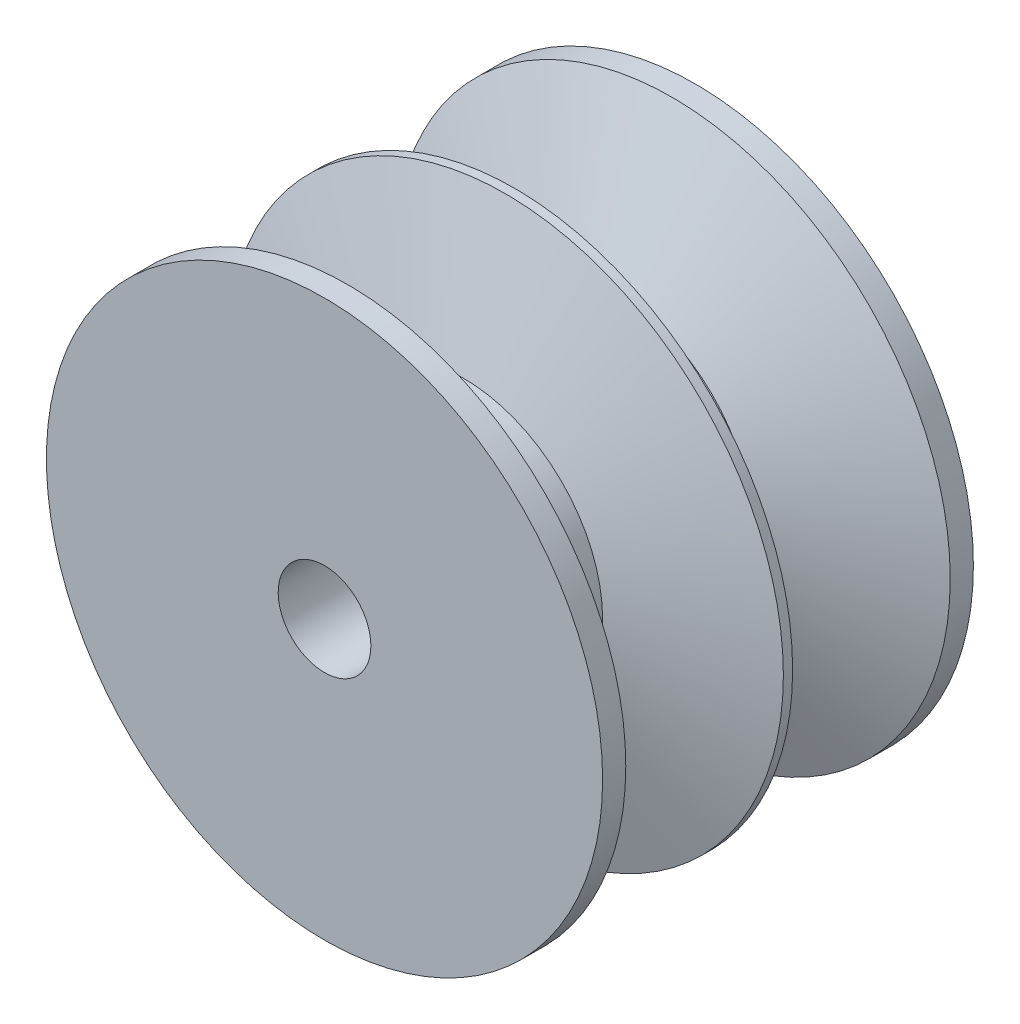
ISO-10303-21;
HEADER;
FILE_DESCRIPTION(('STEP AP214'),'2;1');
FILE_NAME('part.step','',(''),(''),'','','');
FILE_SCHEMA(('AUTOMOTIVE_DESIGN { 1 0 10303 214 1 1 1 1 }'));
ENDSEC;
DATA;
#1=APPLICATION_CONTEXT('core data for automotive mechanical design processes');
#2=APPLICATION_PROTOCOL_DEFINITION('international standard','automotive_design',2000,#1);
#3=PRODUCT_CONTEXT('',#1,'mechanical');
#4=PRODUCT('Part','Part','',(#3));
#5=PRODUCT_RELATED_PRODUCT_CATEGORY('part','',(#4));
#6=PRODUCT_DEFINITION_FORMATION('','',#4);
#7=PRODUCT_DEFINITION_CONTEXT('part definition',#1,'design');
#8=PRODUCT_DEFINITION('design','',#6,#7);
#9=PRODUCT_DEFINITION_SHAPE('','',#8);
#10=(LENGTH_UNIT() NAMED_UNIT(*) SI_UNIT(.MILLI.,.METRE.));
#11=(NAMED_UNIT(*) PLANE_ANGLE_UNIT() SI_UNIT($,.RADIAN.));
#12=(NAMED_UNIT(*) SI_UNIT($,.STERADIAN.) SOLID_ANGLE_UNIT());
#13=UNCERTAINTY_MEASURE_WITH_UNIT(LENGTH_MEASURE(1.E-05),#10,'distance_accuracy_value','');
#14=(GEOMETRIC_REPRESENTATION_CONTEXT(3) GLOBAL_UNCERTAINTY_ASSIGNED_CONTEXT((#13)) GLOBAL_UNIT_ASSIGNED_CONTEXT((#10,
#11,#12)) REPRESENTATION_CONTEXT('',''));
#15=CARTESIAN_POINT('',(0.,0.,0.));
#16=DIRECTION('',(0.,0.,1.));
#17=DIRECTION('',(1.,0.,0.));
#18=AXIS2_PLACEMENT_3D('',#15,#16,#17);
#19=CARTESIAN_POINT('',(0.,0.,8.));
#20=DIRECTION('',(0.,0.,-1.));
#21=DIRECTION('',(-1.,0.,0.));
#22=AXIS2_PLACEMENT_3D('',#19,#20,#21);
#23=PLANE('',#22);
#24=CARTESIAN_POINT('',(0.,0.,8.));
#25=DIRECTION('',(0.,0.,1.));
#26=DIRECTION('',(1.,0.,0.));
#27=AXIS2_PLACEMENT_3D('',#24,#25,#26);
#28=CIRCLE('',#27,2.);
#29=CARTESIAN_POINT('',(2.,0.,8.));
#30=VERTEX_POINT('',#29);
#31=EDGE_CURVE('E72',#30,#30,#28,.T.);
#32=ORIENTED_EDGE('',*,*,#31,.F.);
#33=EDGE_LOOP('',(#32));
#34=FACE_BOUND('',#33,.T.);
#35=CARTESIAN_POINT('',(0.,0.,8.));
#36=DIRECTION('',(0.,0.,1.));
#37=DIRECTION('',(1.,0.,0.));
#38=AXIS2_PLACEMENT_3D('',#35,#36,#37);
#39=CIRCLE('',#38,12.);
#40=CARTESIAN_POINT('',(12.,0.,8.));
#41=VERTEX_POINT('',#40);
#42=EDGE_CURVE('E11',#41,#41,#39,.T.);
#43=ORIENTED_EDGE('',*,*,#42,.T.);
#44=EDGE_LOOP('',(#43));
#45=FACE_BOUND('',#44,.T.);
#46=ADVANCED_FACE('F33',(#34,#45),#23,.F.);
#47=CARTESIAN_POINT('',(0.,0.,8.));
#48=DIRECTION('',(0.,0.,1.));
#49=DIRECTION('',(1.,0.,0.));
#50=AXIS2_PLACEMENT_3D('',#47,#48,#49);
#51=CYLINDRICAL_SURFACE('',#50,12.);
#52=ORIENTED_EDGE('',*,*,#42,.F.);
#53=EDGE_LOOP('',(#52));
#54=FACE_BOUND('',#53,.T.);
#55=CARTESIAN_POINT('',(0.,0.,7.));
#56=DIRECTION('',(0.,0.,1.));
#57=DIRECTION('',(1.,0.,0.));
#58=AXIS2_PLACEMENT_3D('',#55,#56,#57);
#59=CIRCLE('',#58,12.);
#60=CARTESIAN_POINT('',(12.,0.,7.));
#61=VERTEX_POINT('',#60);
#62=EDGE_CURVE('E41',#61,#61,#59,.T.);
#63=ORIENTED_EDGE('',*,*,#62,.T.);
#64=EDGE_LOOP('',(#63));
#65=FACE_BOUND('',#64,.T.);
#66=ADVANCED_FACE('F113',(#54,#65),#51,.T.);
#67=CARTESIAN_POINT('',(0.,0.,4.5));
#68=DIRECTION('',(0.,0.,1.));
#69=DIRECTION('',(1.,0.,0.));
#70=AXIS2_PLACEMENT_3D('',#67,#68,#69);
#71=CONICAL_SURFACE('',#70,6.,1.17600520709514);
#72=ORIENTED_EDGE('',*,*,#62,.F.);
#73=EDGE_LOOP('',(#72));
#74=FACE_BOUND('',#73,.T.);
#75=CARTESIAN_POINT('',(0.,0.,4.5));
#76=DIRECTION('',(0.,0.,1.));
#77=DIRECTION('',(1.,0.,0.));
#78=AXIS2_PLACEMENT_3D('',#75,#76,#77);
#79=CIRCLE('',#78,6.);
#80=CARTESIAN_POINT('',(6.,0.,4.5));
#81=VERTEX_POINT('',#80);
#82=EDGE_CURVE('E107',#81,#81,#79,.T.);
#83=ORIENTED_EDGE('',*,*,#82,.T.);
#84=EDGE_LOOP('',(#83));
#85=FACE_BOUND('',#84,.T.);
#86=ADVANCED_FACE('F115',(#74,#85),#71,.T.);
#87=CARTESIAN_POINT('',(0.,0.,8.));
#88=DIRECTION('',(0.,0.,1.));
#89=DIRECTION('',(1.,0.,0.));
#90=AXIS2_PLACEMENT_3D('',#87,#88,#89);
#91=CYLINDRICAL_SURFACE('',#90,6.);
#92=ORIENTED_EDGE('',*,*,#82,.F.);
#93=EDGE_LOOP('',(#92));
#94=FACE_BOUND('',#93,.T.);
#95=CARTESIAN_POINT('',(0.,0.,2.));
#96=DIRECTION('',(0.,0.,1.));
#97=DIRECTION('',(1.,0.,0.));
#98=AXIS2_PLACEMENT_3D('',#95,#96,#97);
#99=CIRCLE('',#98,6.);
#100=CARTESIAN_POINT('',(6.,0.,2.));
#101=VERTEX_POINT('',#100);
#102=EDGE_CURVE('E104',#101,#101,#99,.T.);
#103=ORIENTED_EDGE('',*,*,#102,.T.);
#104=EDGE_LOOP('',(#103));
#105=FACE_BOUND('',#104,.T.);
#106=ADVANCED_FACE('F118',(#94,#105),#91,.T.);
#107=CARTESIAN_POINT('',(0.,0.,0.200000000000001));
#108=DIRECTION('',(0.,0.,-1.));
#109=DIRECTION('',(-1.,0.,0.));
#110=AXIS2_PLACEMENT_3D('',#107,#108,#109);
#111=CONICAL_SURFACE('',#110,12.,1.27933953231703);
#112=ORIENTED_EDGE('',*,*,#102,.F.);
#113=EDGE_LOOP('',(#112));
#114=FACE_BOUND('',#113,.T.);
#115=CARTESIAN_POINT('',(0.,0.,0.200000000000001));
#116=DIRECTION('',(0.,0.,1.));
#117=DIRECTION('',(1.,0.,0.));
#118=AXIS2_PLACEMENT_3D('',#115,#116,#117);
#119=CIRCLE('',#118,12.);
#120=CARTESIAN_POINT('',(12.,0.,0.200000000000001));
#121=VERTEX_POINT('',#120);
#122=EDGE_CURVE('E101',#121,#121,#119,.T.);
#123=ORIENTED_EDGE('',*,*,#122,.T.);
#124=EDGE_LOOP('',(#123));
#125=FACE_BOUND('',#124,.T.);
#126=ADVANCED_FACE('F124',(#114,#125),#111,.T.);
#127=CARTESIAN_POINT('',(0.,0.,8.));
#128=DIRECTION('',(0.,0.,1.));
#129=DIRECTION('',(1.,0.,0.));
#130=AXIS2_PLACEMENT_3D('',#127,#128,#129);
#131=CYLINDRICAL_SURFACE('',#130,12.);
#132=ORIENTED_EDGE('',*,*,#122,.F.);
#133=EDGE_LOOP('',(#132));
#134=FACE_BOUND('',#133,.T.);
#135=CARTESIAN_POINT('',(0.,0.,-0.199999999999999));
#136=DIRECTION('',(0.,0.,1.));
#137=DIRECTION('',(1.,0.,0.));
#138=AXIS2_PLACEMENT_3D('',#135,#136,#137);
#139=CIRCLE('',#138,12.);
#140=CARTESIAN_POINT('',(12.,0.,-0.199999999999999));
#141=VERTEX_POINT('',#140);
#142=EDGE_CURVE('E98',#141,#141,#139,.T.);
#143=ORIENTED_EDGE('',*,*,#142,.T.);
#144=EDGE_LOOP('',(#143));
#145=FACE_BOUND('',#144,.T.);
#146=ADVANCED_FACE('F130',(#134,#145),#131,.T.);
#147=CARTESIAN_POINT('',(0.,0.,-2.));
#148=DIRECTION('',(0.,0.,1.));
#149=DIRECTION('',(1.,0.,0.));
#150=AXIS2_PLACEMENT_3D('',#147,#148,#149);
#151=CONICAL_SURFACE('',#150,6.,1.27933953231703);
#152=ORIENTED_EDGE('',*,*,#142,.F.);
#153=EDGE_LOOP('',(#152));
#154=FACE_BOUND('',#153,.T.);
#155=CARTESIAN_POINT('',(0.,0.,-2.));
#156=DIRECTION('',(0.,0.,1.));
#157=DIRECTION('',(1.,0.,0.));
#158=AXIS2_PLACEMENT_3D('',#155,#156,#157);
#159=CIRCLE('',#158,6.);
#160=CARTESIAN_POINT('',(6.,0.,-2.));
#161=VERTEX_POINT('',#160);
#162=EDGE_CURVE('E95',#161,#161,#159,.T.);
#163=ORIENTED_EDGE('',*,*,#162,.T.);
#164=EDGE_LOOP('',(#163));
#165=FACE_BOUND('',#164,.T.);
#166=ADVANCED_FACE('F136',(#154,#165),#151,.T.);
#167=CARTESIAN_POINT('',(0.,0.,8.));
#168=DIRECTION('',(0.,0.,1.));
#169=DIRECTION('',(1.,0.,0.));
#170=AXIS2_PLACEMENT_3D('',#167,#168,#169);
#171=CYLINDRICAL_SURFACE('',#170,6.);
#172=ORIENTED_EDGE('',*,*,#162,.F.);
#173=EDGE_LOOP('',(#172));
#174=FACE_BOUND('',#173,.T.);
#175=CARTESIAN_POINT('',(0.,0.,-4.5));
#176=DIRECTION('',(0.,0.,1.));
#177=DIRECTION('',(1.,0.,0.));
#178=AXIS2_PLACEMENT_3D('',#175,#176,#177);
#179=CIRCLE('',#178,6.);
#180=CARTESIAN_POINT('',(6.,0.,-4.5));
#181=VERTEX_POINT('',#180);
#182=EDGE_CURVE('E92',#181,#181,#179,.T.);
#183=ORIENTED_EDGE('',*,*,#182,.T.);
#184=EDGE_LOOP('',(#183));
#185=FACE_BOUND('',#184,.T.);
#186=ADVANCED_FACE('F142',(#174,#185),#171,.T.);
#187=CARTESIAN_POINT('',(0.,0.,-7.));
#188=DIRECTION('',(0.,0.,-1.));
#189=DIRECTION('',(-1.,0.,0.));
#190=AXIS2_PLACEMENT_3D('',#187,#188,#189);
#191=CONICAL_SURFACE('',#190,12.,1.17600520709514);
#192=ORIENTED_EDGE('',*,*,#182,.F.);
#193=EDGE_LOOP('',(#192));
#194=FACE_BOUND('',#193,.T.);
#195=CARTESIAN_POINT('',(0.,0.,-7.));
#196=DIRECTION('',(0.,0.,1.));
#197=DIRECTION('',(1.,0.,0.));
#198=AXIS2_PLACEMENT_3D('',#195,#196,#197);
#199=CIRCLE('',#198,12.);
#200=CARTESIAN_POINT('',(12.,0.,-7.));
#201=VERTEX_POINT('',#200);
#202=EDGE_CURVE('E78',#201,#201,#199,.T.);
#203=ORIENTED_EDGE('',*,*,#202,.T.);
#204=EDGE_LOOP('',(#203));
#205=FACE_BOUND('',#204,.T.);
#206=ADVANCED_FACE('F148',(#194,#205),#191,.T.);
#207=CARTESIAN_POINT('',(0.,0.,8.));
#208=DIRECTION('',(0.,0.,1.));
#209=DIRECTION('',(1.,0.,0.));
#210=AXIS2_PLACEMENT_3D('',#207,#208,#209);
#211=CYLINDRICAL_SURFACE('',#210,12.);
#212=ORIENTED_EDGE('',*,*,#202,.F.);
#213=EDGE_LOOP('',(#212));
#214=FACE_BOUND('',#213,.T.);
#215=CARTESIAN_POINT('',(0.,0.,-8.));
#216=DIRECTION('',(0.,0.,1.));
#217=DIRECTION('',(1.,0.,0.));
#218=AXIS2_PLACEMENT_3D('',#215,#216,#217);
#219=CIRCLE('',#218,12.);
#220=CARTESIAN_POINT('',(12.,0.,-8.));
#221=VERTEX_POINT('',#220);
#222=EDGE_CURVE('E76',#221,#221,#219,.T.);
#223=ORIENTED_EDGE('',*,*,#222,.T.);
#224=EDGE_LOOP('',(#223));
#225=FACE_BOUND('',#224,.T.);
#226=ADVANCED_FACE('F154',(#214,#225),#211,.T.);
#227=CARTESIAN_POINT('',(0.,12.,-8.));
#228=DIRECTION('',(0.,0.,1.));
#229=DIRECTION('',(1.,0.,0.));
#230=AXIS2_PLACEMENT_3D('',#227,#228,#229);
#231=PLANE('',#230);
#232=DIRECTION('',(1.,0.,0.));
#233=VECTOR('',#232,1.);
#234=CARTESIAN_POINT('',(1.3228756555323,1.5,-8.));
#235=LINE('',#234,#233);
#236=CARTESIAN_POINT('',(-1.3228756555323,1.5,-8.));
#237=VERTEX_POINT('',#236);
#238=CARTESIAN_POINT('',(1.3228756555323,1.5,-8.));
#239=VERTEX_POINT('',#238);
#240=EDGE_CURVE('E66',#237,#239,#235,.T.);
#241=ORIENTED_EDGE('',*,*,#240,.F.);
#242=CARTESIAN_POINT('',(0.,0.,-8.));
#243=DIRECTION('',(0.,0.,-1.));
#244=DIRECTION('',(-1.,0.,0.));
#245=AXIS2_PLACEMENT_3D('',#242,#243,#244);
#246=CIRCLE('',#245,2.);
#247=EDGE_CURVE('E49',#239,#237,#246,.T.);
#248=ORIENTED_EDGE('',*,*,#247,.F.);
#249=EDGE_LOOP('',(#241,#248));
#250=FACE_BOUND('',#249,.T.);
#251=ORIENTED_EDGE('',*,*,#222,.F.);
#252=EDGE_LOOP('',(#251));
#253=FACE_BOUND('',#252,.T.);
#254=ADVANCED_FACE('F160',(#250,#253),#231,.F.);
#255=CARTESIAN_POINT('',(0.,0.,4.));
#256=DIRECTION('',(0.,0.,-1.));
#257=DIRECTION('',(-1.,0.,0.));
#258=AXIS2_PLACEMENT_3D('',#255,#256,#257);
#259=CYLINDRICAL_SURFACE('',#258,2.);
#260=ORIENTED_EDGE('',*,*,#247,.T.);
#261=DIRECTION('',(0.,0.,-1.));
#262=VECTOR('',#261,1.);
#263=CARTESIAN_POINT('',(-1.3228756555323,1.5,4.));
#264=LINE('',#263,#262);
#265=CARTESIAN_POINT('',(-1.3228756555323,1.5,4.));
#266=VERTEX_POINT('',#265);
#267=EDGE_CURVE('E65',#266,#237,#264,.T.);
#268=ORIENTED_EDGE('',*,*,#267,.F.);
#269=CARTESIAN_POINT('',(0.,0.,4.));
#270=DIRECTION('',(0.,0.,1.));
#271=DIRECTION('',(1.,0.,0.));
#272=AXIS2_PLACEMENT_3D('',#269,#270,#271);
#273=CIRCLE('',#272,2.);
#274=CARTESIAN_POINT('',(1.3228756555323,1.5,4.));
#275=VERTEX_POINT('',#274);
#276=EDGE_CURVE('E57',#275,#266,#273,.T.);
#277=ORIENTED_EDGE('',*,*,#276,.F.);
#278=DIRECTION('',(0.,0.,-1.));
#279=VECTOR('',#278,1.);
#280=CARTESIAN_POINT('',(1.3228756555323,1.5,4.));
#281=LINE('',#280,#279);
#282=EDGE_CURVE('E70',#275,#239,#281,.T.);
#283=ORIENTED_EDGE('',*,*,#282,.T.);
#284=EDGE_LOOP('',(#260,#268,#277,#283));
#285=FACE_BOUND('',#284,.T.);
#286=ORIENTED_EDGE('',*,*,#31,.T.);
#287=EDGE_LOOP('',(#286));
#288=FACE_BOUND('',#287,.T.);
#289=ADVANCED_FACE('F68',(#285,#288),#259,.F.);
#290=CARTESIAN_POINT('',(1.3228756555323,1.5,4.));
#291=DIRECTION('',(0.,1.,0.));
#292=DIRECTION('',(0.,0.,1.));
#293=AXIS2_PLACEMENT_3D('',#290,#291,#292);
#294=PLANE('',#293);
#295=ORIENTED_EDGE('',*,*,#240,.T.);
#296=ORIENTED_EDGE('',*,*,#282,.F.);
#297=DIRECTION('',(1.,0.,0.));
#298=VECTOR('',#297,1.);
#299=CARTESIAN_POINT('',(1.3228756555323,1.5,4.));
#300=LINE('',#299,#298);
#301=EDGE_CURVE('E61',#266,#275,#300,.T.);
#302=ORIENTED_EDGE('',*,*,#301,.F.);
#303=ORIENTED_EDGE('',*,*,#267,.T.);
#304=EDGE_LOOP('',(#295,#296,#302,#303));
#305=FACE_BOUND('',#304,.T.);
#306=ADVANCED_FACE('F74',(#305),#294,.F.);
#307=CARTESIAN_POINT('',(0.,0.,4.));
#308=DIRECTION('',(0.,0.,1.));
#309=DIRECTION('',(1.,0.,0.));
#310=AXIS2_PLACEMENT_3D('',#307,#308,#309);
#311=PLANE('',#310);
#312=ORIENTED_EDGE('',*,*,#301,.T.);
#313=ORIENTED_EDGE('',*,*,#276,.T.);
#314=EDGE_LOOP('',(#312,#313));
#315=FACE_BOUND('',#314,.T.);
#316=ADVANCED_FACE('F62',(#315),#311,.T.);
#317=CLOSED_SHELL('',(#46,#66,#86,#106,#126,#146,#166,#186,#206,#226,#254,#289,#306,#316));
#318=MANIFOLD_SOLID_BREP('B2',#317);
#319=ADVANCED_BREP_SHAPE_REPRESENTATION('',(#18,#318),#14);
#320=SHAPE_DEFINITION_REPRESENTATION(#9,#319);
ENDSEC;
END-ISO-10303-21;
